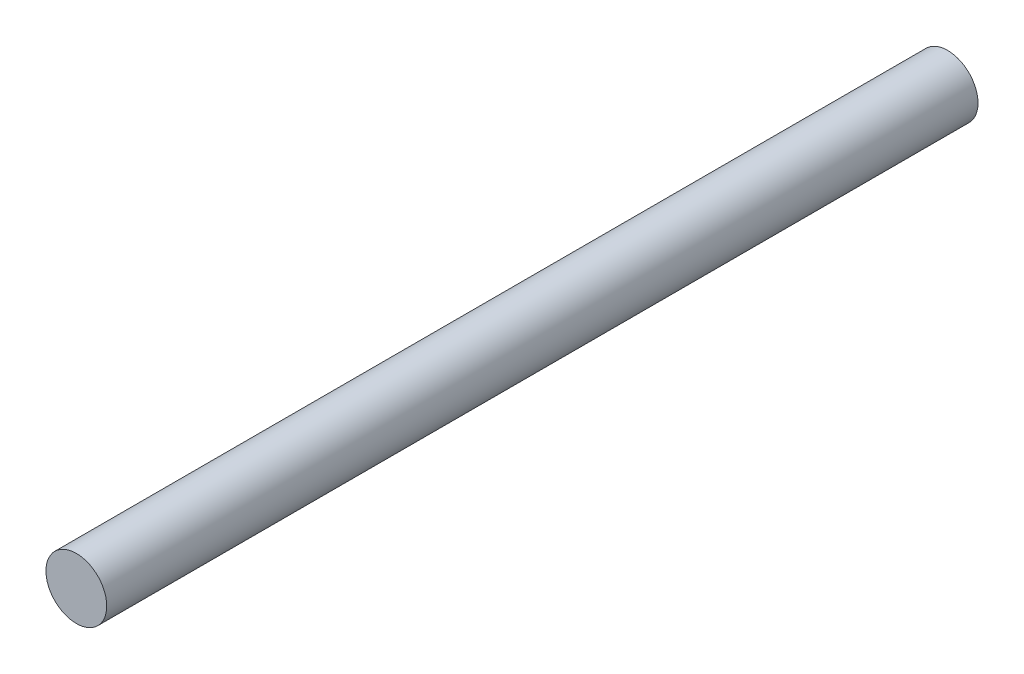
ISO-10303-21;
HEADER;
FILE_DESCRIPTION(('STEP AP214'),'2;1');
FILE_NAME('part.step','',(''),(''),'','','');
FILE_SCHEMA(('AUTOMOTIVE_DESIGN { 1 0 10303 214 1 1 1 1 }'));
ENDSEC;
DATA;
#1=APPLICATION_CONTEXT('core data for automotive mechanical design processes');
#2=APPLICATION_PROTOCOL_DEFINITION('international standard','automotive_design',2000,#1);
#3=PRODUCT_CONTEXT('',#1,'mechanical');
#4=PRODUCT('Part','Part','',(#3));
#5=PRODUCT_RELATED_PRODUCT_CATEGORY('part','',(#4));
#6=PRODUCT_DEFINITION_FORMATION('','',#4);
#7=PRODUCT_DEFINITION_CONTEXT('part definition',#1,'design');
#8=PRODUCT_DEFINITION('design','',#6,#7);
#9=PRODUCT_DEFINITION_SHAPE('','',#8);
#10=(LENGTH_UNIT() NAMED_UNIT(*) SI_UNIT(.MILLI.,.METRE.));
#11=(NAMED_UNIT(*) PLANE_ANGLE_UNIT() SI_UNIT($,.RADIAN.));
#12=(NAMED_UNIT(*) SI_UNIT($,.STERADIAN.) SOLID_ANGLE_UNIT());
#13=UNCERTAINTY_MEASURE_WITH_UNIT(LENGTH_MEASURE(1.E-05),#10,'distance_accuracy_value','');
#14=(GEOMETRIC_REPRESENTATION_CONTEXT(3) GLOBAL_UNCERTAINTY_ASSIGNED_CONTEXT((#13)) GLOBAL_UNIT_ASSIGNED_CONTEXT((#10,
#11,#12)) REPRESENTATION_CONTEXT('',''));
#15=CARTESIAN_POINT('',(0.,0.,0.));
#16=DIRECTION('',(0.,0.,1.));
#17=DIRECTION('',(1.,0.,0.));
#18=AXIS2_PLACEMENT_3D('',#15,#16,#17);
#19=CARTESIAN_POINT('',(0.,0.,43.));
#20=DIRECTION('',(0.,0.,-1.));
#21=DIRECTION('',(-1.,0.,0.));
#22=AXIS2_PLACEMENT_3D('',#19,#20,#21);
#23=CYLINDRICAL_SURFACE('',#22,1.5);
#24=CARTESIAN_POINT('',(0.,0.,43.));
#25=DIRECTION('',(0.,0.,1.));
#26=DIRECTION('',(1.,0.,0.));
#27=AXIS2_PLACEMENT_3D('',#24,#25,#26);
#28=CIRCLE('',#27,1.5);
#29=CARTESIAN_POINT('',(1.5,0.,43.));
#30=VERTEX_POINT('',#29);
#31=EDGE_CURVE('E10',#30,#30,#28,.T.);
#32=ORIENTED_EDGE('',*,*,#31,.F.);
#33=EDGE_LOOP('',(#32));
#34=FACE_BOUND('',#33,.T.);
#35=CARTESIAN_POINT('',(0.,0.,0.));
#36=DIRECTION('',(0.,0.,1.));
#37=DIRECTION('',(1.,0.,0.));
#38=AXIS2_PLACEMENT_3D('',#35,#36,#37);
#39=CIRCLE('',#38,1.5);
#40=CARTESIAN_POINT('',(1.5,0.,0.));
#41=VERTEX_POINT('',#40);
#42=EDGE_CURVE('E40',#41,#41,#39,.T.);
#43=ORIENTED_EDGE('',*,*,#42,.T.);
#44=EDGE_LOOP('',(#43));
#45=FACE_BOUND('',#44,.T.);
#46=ADVANCED_FACE('F37',(#34,#45),#23,.T.);
#47=CARTESIAN_POINT('',(0.,0.,43.));
#48=DIRECTION('',(0.,0.,1.));
#49=DIRECTION('',(1.,0.,0.));
#50=AXIS2_PLACEMENT_3D('',#47,#48,#49);
#51=PLANE('',#50);
#52=ORIENTED_EDGE('',*,*,#31,.T.);
#53=EDGE_LOOP('',(#52));
#54=FACE_BOUND('',#53,.T.);
#55=ADVANCED_FACE('F54',(#54),#51,.T.);
#56=CARTESIAN_POINT('',(0.,0.,0.));
#57=DIRECTION('',(0.,0.,1.));
#58=DIRECTION('',(1.,0.,0.));
#59=AXIS2_PLACEMENT_3D('',#56,#57,#58);
#60=PLANE('',#59);
#61=ORIENTED_EDGE('',*,*,#42,.F.);
#62=EDGE_LOOP('',(#61));
#63=FACE_BOUND('',#62,.T.);
#64=ADVANCED_FACE('F52',(#63),#60,.F.);
#65=CLOSED_SHELL('',(#46,#55,#64));
#66=MANIFOLD_SOLID_BREP('B2',#65);
#67=ADVANCED_BREP_SHAPE_REPRESENTATION('',(#18,#66),#14);
#68=SHAPE_DEFINITION_REPRESENTATION(#9,#67);
ENDSEC;
END-ISO-10303-21;
